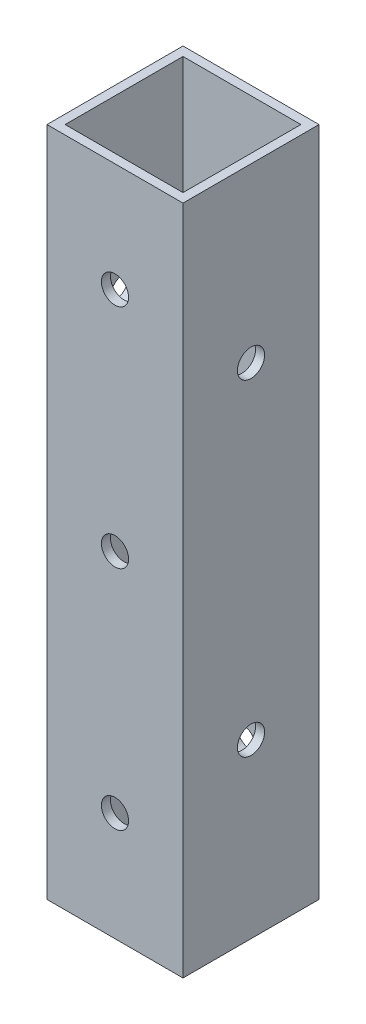
ISO-10303-21;
HEADER;
FILE_DESCRIPTION(('STEP AP214'),'2;1');
FILE_NAME('part.step','',(''),(''),'','','');
FILE_SCHEMA(('AUTOMOTIVE_DESIGN { 1 0 10303 214 1 1 1 1 }'));
ENDSEC;
DATA;
#1=APPLICATION_CONTEXT('core data for automotive mechanical design processes');
#2=APPLICATION_PROTOCOL_DEFINITION('international standard','automotive_design',2000,#1);
#3=PRODUCT_CONTEXT('',#1,'mechanical');
#4=PRODUCT('Part','Part','',(#3));
#5=PRODUCT_RELATED_PRODUCT_CATEGORY('part','',(#4));
#6=PRODUCT_DEFINITION_FORMATION('','',#4);
#7=PRODUCT_DEFINITION_CONTEXT('part definition',#1,'design');
#8=PRODUCT_DEFINITION('design','',#6,#7);
#9=PRODUCT_DEFINITION_SHAPE('','',#8);
#10=(LENGTH_UNIT() NAMED_UNIT(*) SI_UNIT(.MILLI.,.METRE.));
#11=(NAMED_UNIT(*) PLANE_ANGLE_UNIT() SI_UNIT($,.RADIAN.));
#12=(NAMED_UNIT(*) SI_UNIT($,.STERADIAN.) SOLID_ANGLE_UNIT());
#13=UNCERTAINTY_MEASURE_WITH_UNIT(LENGTH_MEASURE(1.E-05),#10,'distance_accuracy_value','');
#14=(GEOMETRIC_REPRESENTATION_CONTEXT(3) GLOBAL_UNCERTAINTY_ASSIGNED_CONTEXT((#13)) GLOBAL_UNIT_ASSIGNED_CONTEXT((#10,
#11,#12)) REPRESENTATION_CONTEXT('',''));
#15=CARTESIAN_POINT('',(0.,0.,0.));
#16=DIRECTION('',(0.,0.,1.));
#17=DIRECTION('',(1.,0.,0.));
#18=AXIS2_PLACEMENT_3D('',#15,#16,#17);
#19=CARTESIAN_POINT('',(0.,74.,0.));
#20=DIRECTION('',(0.,-1.,0.));
#21=DIRECTION('',(0.,0.,-1.));
#22=AXIS2_PLACEMENT_3D('',#19,#20,#21);
#23=PLANE('',#22);
#24=DIRECTION('',(0.,0.,-1.));
#25=VECTOR('',#24,1.);
#26=CARTESIAN_POINT('',(7.5,74.,7.5));
#27=LINE('',#26,#25);
#28=CARTESIAN_POINT('',(7.5,74.,7.5));
#29=VERTEX_POINT('',#28);
#30=CARTESIAN_POINT('',(7.5,74.,-7.5));
#31=VERTEX_POINT('',#30);
#32=EDGE_CURVE('E141',#29,#31,#27,.T.);
#33=ORIENTED_EDGE('',*,*,#32,.T.);
#34=DIRECTION('',(-1.,0.,0.));
#35=VECTOR('',#34,1.);
#36=CARTESIAN_POINT('',(-7.5,74.,-7.5));
#37=LINE('',#36,#35);
#38=CARTESIAN_POINT('',(-7.5,74.,-7.5));
#39=VERTEX_POINT('',#38);
#40=EDGE_CURVE('E144',#31,#39,#37,.T.);
#41=ORIENTED_EDGE('',*,*,#40,.T.);
#42=DIRECTION('',(0.,0.,1.));
#43=VECTOR('',#42,1.);
#44=CARTESIAN_POINT('',(-7.5,74.,7.5));
#45=LINE('',#44,#43);
#46=CARTESIAN_POINT('',(-7.5,74.,7.5));
#47=VERTEX_POINT('',#46);
#48=EDGE_CURVE('E147',#39,#47,#45,.T.);
#49=ORIENTED_EDGE('',*,*,#48,.T.);
#50=DIRECTION('',(1.,0.,0.));
#51=VECTOR('',#50,1.);
#52=CARTESIAN_POINT('',(-7.5,74.,7.5));
#53=LINE('',#52,#51);
#54=EDGE_CURVE('E149',#47,#29,#53,.T.);
#55=ORIENTED_EDGE('',*,*,#54,.T.);
#56=EDGE_LOOP('',(#33,#41,#49,#55));
#57=FACE_BOUND('',#56,.T.);
#58=DIRECTION('',(0.,0.,1.));
#59=VECTOR('',#58,1.);
#60=CARTESIAN_POINT('',(-6.5,74.,6.5));
#61=LINE('',#60,#59);
#62=CARTESIAN_POINT('',(-6.5,74.,-6.5));
#63=VERTEX_POINT('',#62);
#64=CARTESIAN_POINT('',(-6.5,74.,6.5));
#65=VERTEX_POINT('',#64);
#66=EDGE_CURVE('E103',#63,#65,#61,.T.);
#67=ORIENTED_EDGE('',*,*,#66,.F.);
#68=DIRECTION('',(-1.,0.,0.));
#69=VECTOR('',#68,1.);
#70=CARTESIAN_POINT('',(-6.5,74.,-6.5));
#71=LINE('',#70,#69);
#72=CARTESIAN_POINT('',(6.5,74.,-6.5));
#73=VERTEX_POINT('',#72);
#74=EDGE_CURVE('E125',#73,#63,#71,.T.);
#75=ORIENTED_EDGE('',*,*,#74,.F.);
#76=DIRECTION('',(0.,0.,-1.));
#77=VECTOR('',#76,1.);
#78=CARTESIAN_POINT('',(6.5,74.,6.5));
#79=LINE('',#78,#77);
#80=CARTESIAN_POINT('',(6.5,74.,6.5));
#81=VERTEX_POINT('',#80);
#82=EDGE_CURVE('E123',#81,#73,#79,.T.);
#83=ORIENTED_EDGE('',*,*,#82,.F.);
#84=DIRECTION('',(1.,0.,0.));
#85=VECTOR('',#84,1.);
#86=CARTESIAN_POINT('',(-6.5,74.,6.5));
#87=LINE('',#86,#85);
#88=EDGE_CURVE('E111',#65,#81,#87,.T.);
#89=ORIENTED_EDGE('',*,*,#88,.F.);
#90=EDGE_LOOP('',(#67,#75,#83,#89));
#91=FACE_BOUND('',#90,.T.);
#92=ADVANCED_FACE('F36',(#57,#91),#23,.F.);
#93=CARTESIAN_POINT('',(0.,0.,0.));
#94=DIRECTION('',(0.,-1.,0.));
#95=DIRECTION('',(0.,0.,-1.));
#96=AXIS2_PLACEMENT_3D('',#93,#94,#95);
#97=PLANE('',#96);
#98=DIRECTION('',(0.,0.,-1.));
#99=VECTOR('',#98,1.);
#100=CARTESIAN_POINT('',(7.5,0.,7.5));
#101=LINE('',#100,#99);
#102=CARTESIAN_POINT('',(7.5,0.,7.5));
#103=VERTEX_POINT('',#102);
#104=CARTESIAN_POINT('',(7.5,0.,-7.5));
#105=VERTEX_POINT('',#104);
#106=EDGE_CURVE('E119',#103,#105,#101,.T.);
#107=ORIENTED_EDGE('',*,*,#106,.F.);
#108=DIRECTION('',(1.,0.,0.));
#109=VECTOR('',#108,1.);
#110=CARTESIAN_POINT('',(-7.5,0.,7.5));
#111=LINE('',#110,#109);
#112=CARTESIAN_POINT('',(-7.5,0.,7.5));
#113=VERTEX_POINT('',#112);
#114=EDGE_CURVE('E145',#113,#103,#111,.T.);
#115=ORIENTED_EDGE('',*,*,#114,.F.);
#116=DIRECTION('',(0.,0.,1.));
#117=VECTOR('',#116,1.);
#118=CARTESIAN_POINT('',(-7.5,0.,7.5));
#119=LINE('',#118,#117);
#120=CARTESIAN_POINT('',(-7.5,0.,-7.5));
#121=VERTEX_POINT('',#120);
#122=EDGE_CURVE('E156',#121,#113,#119,.T.);
#123=ORIENTED_EDGE('',*,*,#122,.F.);
#124=DIRECTION('',(-1.,0.,0.));
#125=VECTOR('',#124,1.);
#126=CARTESIAN_POINT('',(-7.5,0.,-7.5));
#127=LINE('',#126,#125);
#128=EDGE_CURVE('E154',#105,#121,#127,.T.);
#129=ORIENTED_EDGE('',*,*,#128,.F.);
#130=EDGE_LOOP('',(#107,#115,#123,#129));
#131=FACE_BOUND('',#130,.T.);
#132=DIRECTION('',(-1.,0.,0.));
#133=VECTOR('',#132,1.);
#134=CARTESIAN_POINT('',(-6.5,0.,-6.5));
#135=LINE('',#134,#133);
#136=CARTESIAN_POINT('',(6.5,0.,-6.5));
#137=VERTEX_POINT('',#136);
#138=CARTESIAN_POINT('',(-6.5,0.,-6.5));
#139=VERTEX_POINT('',#138);
#140=EDGE_CURVE('E112',#137,#139,#135,.T.);
#141=ORIENTED_EDGE('',*,*,#140,.T.);
#142=DIRECTION('',(0.,0.,1.));
#143=VECTOR('',#142,1.);
#144=CARTESIAN_POINT('',(-6.5,0.,6.5));
#145=LINE('',#144,#143);
#146=CARTESIAN_POINT('',(-6.5,0.,6.5));
#147=VERTEX_POINT('',#146);
#148=EDGE_CURVE('E61',#139,#147,#145,.T.);
#149=ORIENTED_EDGE('',*,*,#148,.T.);
#150=DIRECTION('',(1.,0.,0.));
#151=VECTOR('',#150,1.);
#152=CARTESIAN_POINT('',(-6.5,0.,6.5));
#153=LINE('',#152,#151);
#154=CARTESIAN_POINT('',(6.5,0.,6.5));
#155=VERTEX_POINT('',#154);
#156=EDGE_CURVE('E118',#147,#155,#153,.T.);
#157=ORIENTED_EDGE('',*,*,#156,.T.);
#158=DIRECTION('',(0.,0.,-1.));
#159=VECTOR('',#158,1.);
#160=CARTESIAN_POINT('',(6.5,0.,6.5));
#161=LINE('',#160,#159);
#162=EDGE_CURVE('E133',#155,#137,#161,.T.);
#163=ORIENTED_EDGE('',*,*,#162,.T.);
#164=EDGE_LOOP('',(#141,#149,#157,#163));
#165=FACE_BOUND('',#164,.T.);
#166=ADVANCED_FACE('F239',(#131,#165),#97,.T.);
#167=CARTESIAN_POINT('',(7.5,74.,7.5));
#168=DIRECTION('',(-1.,0.,0.));
#169=DIRECTION('',(0.,0.,1.));
#170=AXIS2_PLACEMENT_3D('',#167,#168,#169);
#171=PLANE('',#170);
#172=CARTESIAN_POINT('',(7.5,19.,0.));
#173=DIRECTION('',(1.,0.,0.));
#174=DIRECTION('',(0.,0.,-1.));
#175=AXIS2_PLACEMENT_3D('',#172,#173,#174);
#176=CIRCLE('',#175,1.5);
#177=CARTESIAN_POINT('',(7.5,19.,-1.50000000000001));
#178=VERTEX_POINT('',#177);
#179=EDGE_CURVE('E323',#178,#178,#176,.T.);
#180=ORIENTED_EDGE('',*,*,#179,.F.);
#181=EDGE_LOOP('',(#180));
#182=FACE_BOUND('',#181,.T.);
#183=CARTESIAN_POINT('',(7.5,55.,0.));
#184=DIRECTION('',(1.,0.,0.));
#185=DIRECTION('',(0.,0.,-1.));
#186=AXIS2_PLACEMENT_3D('',#183,#184,#185);
#187=CIRCLE('',#186,1.5);
#188=CARTESIAN_POINT('',(7.5,55.,-1.50000000000001));
#189=VERTEX_POINT('',#188);
#190=EDGE_CURVE('E188',#189,#189,#187,.T.);
#191=ORIENTED_EDGE('',*,*,#190,.F.);
#192=EDGE_LOOP('',(#191));
#193=FACE_BOUND('',#192,.T.);
#194=ORIENTED_EDGE('',*,*,#106,.T.);
#195=DIRECTION('',(0.,-1.,0.));
#196=VECTOR('',#195,1.);
#197=CARTESIAN_POINT('',(7.5,74.,-7.5));
#198=LINE('',#197,#196);
#199=EDGE_CURVE('E11',#31,#105,#198,.T.);
#200=ORIENTED_EDGE('',*,*,#199,.F.);
#201=ORIENTED_EDGE('',*,*,#32,.F.);
#202=DIRECTION('',(0.,-1.,0.));
#203=VECTOR('',#202,1.);
#204=CARTESIAN_POINT('',(7.5,74.,7.5));
#205=LINE('',#204,#203);
#206=EDGE_CURVE('E151',#29,#103,#205,.T.);
#207=ORIENTED_EDGE('',*,*,#206,.T.);
#208=EDGE_LOOP('',(#194,#200,#201,#207));
#209=FACE_BOUND('',#208,.T.);
#210=ADVANCED_FACE('F38',(#182,#193,#209),#171,.F.);
#211=CARTESIAN_POINT('',(-7.5,74.,-7.5));
#212=DIRECTION('',(0.,0.,1.));
#213=DIRECTION('',(1.,0.,0.));
#214=AXIS2_PLACEMENT_3D('',#211,#212,#213);
#215=PLANE('',#214);
#216=CARTESIAN_POINT('',(0.,37.,-7.5));
#217=DIRECTION('',(0.,0.,1.));
#218=DIRECTION('',(1.,0.,0.));
#219=AXIS2_PLACEMENT_3D('',#216,#217,#218);
#220=CIRCLE('',#219,1.5);
#221=CARTESIAN_POINT('',(1.5,37.,-7.5));
#222=VERTEX_POINT('',#221);
#223=EDGE_CURVE('E174',#222,#222,#220,.T.);
#224=ORIENTED_EDGE('',*,*,#223,.T.);
#225=EDGE_LOOP('',(#224));
#226=FACE_BOUND('',#225,.T.);
#227=CARTESIAN_POINT('',(0.,12.,-7.5));
#228=DIRECTION('',(0.,0.,1.));
#229=DIRECTION('',(1.,0.,0.));
#230=AXIS2_PLACEMENT_3D('',#227,#228,#229);
#231=CIRCLE('',#230,1.5);
#232=CARTESIAN_POINT('',(1.50000000000001,12.,-7.5));
#233=VERTEX_POINT('',#232);
#234=EDGE_CURVE('E203',#233,#233,#231,.T.);
#235=ORIENTED_EDGE('',*,*,#234,.T.);
#236=EDGE_LOOP('',(#235));
#237=FACE_BOUND('',#236,.T.);
#238=CARTESIAN_POINT('',(0.,62.,-7.5));
#239=DIRECTION('',(0.,0.,1.));
#240=DIRECTION('',(1.,0.,0.));
#241=AXIS2_PLACEMENT_3D('',#238,#239,#240);
#242=CIRCLE('',#241,1.5);
#243=CARTESIAN_POINT('',(1.5,62.,-7.5));
#244=VERTEX_POINT('',#243);
#245=EDGE_CURVE('E169',#244,#244,#242,.T.);
#246=ORIENTED_EDGE('',*,*,#245,.T.);
#247=EDGE_LOOP('',(#246));
#248=FACE_BOUND('',#247,.T.);
#249=ORIENTED_EDGE('',*,*,#128,.T.);
#250=DIRECTION('',(0.,-1.,0.));
#251=VECTOR('',#250,1.);
#252=CARTESIAN_POINT('',(-7.5,74.,-7.5));
#253=LINE('',#252,#251);
#254=EDGE_CURVE('E45',#39,#121,#253,.T.);
#255=ORIENTED_EDGE('',*,*,#254,.F.);
#256=ORIENTED_EDGE('',*,*,#40,.F.);
#257=ORIENTED_EDGE('',*,*,#199,.T.);
#258=EDGE_LOOP('',(#249,#255,#256,#257));
#259=FACE_BOUND('',#258,.T.);
#260=ADVANCED_FACE('F253',(#226,#237,#248,#259),#215,.F.);
#261=CARTESIAN_POINT('',(-7.5,74.,7.5));
#262=DIRECTION('',(1.,0.,0.));
#263=DIRECTION('',(0.,0.,-1.));
#264=AXIS2_PLACEMENT_3D('',#261,#262,#263);
#265=PLANE('',#264);
#266=CARTESIAN_POINT('',(-7.5,19.,0.));
#267=DIRECTION('',(1.,0.,0.));
#268=DIRECTION('',(0.,0.,-1.));
#269=AXIS2_PLACEMENT_3D('',#266,#267,#268);
#270=CIRCLE('',#269,1.5);
#271=CARTESIAN_POINT('',(-7.5,19.,-1.50000000000001));
#272=VERTEX_POINT('',#271);
#273=EDGE_CURVE('E324',#272,#272,#270,.T.);
#274=ORIENTED_EDGE('',*,*,#273,.T.);
#275=EDGE_LOOP('',(#274));
#276=FACE_BOUND('',#275,.T.);
#277=CARTESIAN_POINT('',(-7.5,55.,0.));
#278=DIRECTION('',(1.,0.,0.));
#279=DIRECTION('',(0.,0.,-1.));
#280=AXIS2_PLACEMENT_3D('',#277,#278,#279);
#281=CIRCLE('',#280,1.5);
#282=CARTESIAN_POINT('',(-7.5,55.,-1.50000000000001));
#283=VERTEX_POINT('',#282);
#284=EDGE_CURVE('E181',#283,#283,#281,.T.);
#285=ORIENTED_EDGE('',*,*,#284,.T.);
#286=EDGE_LOOP('',(#285));
#287=FACE_BOUND('',#286,.T.);
#288=ORIENTED_EDGE('',*,*,#122,.T.);
#289=DIRECTION('',(0.,-1.,0.));
#290=VECTOR('',#289,1.);
#291=CARTESIAN_POINT('',(-7.5,74.,7.5));
#292=LINE('',#291,#290);
#293=EDGE_CURVE('E161',#47,#113,#292,.T.);
#294=ORIENTED_EDGE('',*,*,#293,.F.);
#295=ORIENTED_EDGE('',*,*,#48,.F.);
#296=ORIENTED_EDGE('',*,*,#254,.T.);
#297=EDGE_LOOP('',(#288,#294,#295,#296));
#298=FACE_BOUND('',#297,.T.);
#299=ADVANCED_FACE('F250',(#276,#287,#298),#265,.F.);
#300=CARTESIAN_POINT('',(-7.5,74.,7.5));
#301=DIRECTION('',(0.,0.,-1.));
#302=DIRECTION('',(-1.,0.,0.));
#303=AXIS2_PLACEMENT_3D('',#300,#301,#302);
#304=PLANE('',#303);
#305=CARTESIAN_POINT('',(0.,37.,7.5));
#306=DIRECTION('',(0.,0.,1.));
#307=DIRECTION('',(1.,0.,0.));
#308=AXIS2_PLACEMENT_3D('',#305,#306,#307);
#309=CIRCLE('',#308,1.5);
#310=CARTESIAN_POINT('',(1.5,37.,7.5));
#311=VERTEX_POINT('',#310);
#312=EDGE_CURVE('E200',#311,#311,#309,.T.);
#313=ORIENTED_EDGE('',*,*,#312,.F.);
#314=EDGE_LOOP('',(#313));
#315=FACE_BOUND('',#314,.T.);
#316=CARTESIAN_POINT('',(0.,12.,7.5));
#317=DIRECTION('',(0.,0.,1.));
#318=DIRECTION('',(1.,0.,0.));
#319=AXIS2_PLACEMENT_3D('',#316,#317,#318);
#320=CIRCLE('',#319,1.5);
#321=CARTESIAN_POINT('',(1.50000000000001,12.,7.5));
#322=VERTEX_POINT('',#321);
#323=EDGE_CURVE('E185',#322,#322,#320,.T.);
#324=ORIENTED_EDGE('',*,*,#323,.F.);
#325=EDGE_LOOP('',(#324));
#326=FACE_BOUND('',#325,.T.);
#327=CARTESIAN_POINT('',(0.,62.,7.5));
#328=DIRECTION('',(0.,0.,1.));
#329=DIRECTION('',(1.,0.,0.));
#330=AXIS2_PLACEMENT_3D('',#327,#328,#329);
#331=CIRCLE('',#330,1.5);
#332=CARTESIAN_POINT('',(1.5,62.,7.5));
#333=VERTEX_POINT('',#332);
#334=EDGE_CURVE('E212',#333,#333,#331,.T.);
#335=ORIENTED_EDGE('',*,*,#334,.F.);
#336=EDGE_LOOP('',(#335));
#337=FACE_BOUND('',#336,.T.);
#338=ORIENTED_EDGE('',*,*,#114,.T.);
#339=ORIENTED_EDGE('',*,*,#206,.F.);
#340=ORIENTED_EDGE('',*,*,#54,.F.);
#341=ORIENTED_EDGE('',*,*,#293,.T.);
#342=EDGE_LOOP('',(#338,#339,#340,#341));
#343=FACE_BOUND('',#342,.T.);
#344=ADVANCED_FACE('F233',(#315,#326,#337,#343),#304,.F.);
#345=CARTESIAN_POINT('',(-6.5,74.,6.5));
#346=DIRECTION('',(1.,0.,0.));
#347=DIRECTION('',(0.,0.,-1.));
#348=AXIS2_PLACEMENT_3D('',#345,#346,#347);
#349=PLANE('',#348);
#350=CARTESIAN_POINT('',(-6.5,19.,0.));
#351=DIRECTION('',(1.,0.,0.));
#352=DIRECTION('',(0.,0.,-1.));
#353=AXIS2_PLACEMENT_3D('',#350,#351,#352);
#354=CIRCLE('',#353,1.5);
#355=CARTESIAN_POINT('',(-6.5,19.,-1.50000000000001));
#356=VERTEX_POINT('',#355);
#357=EDGE_CURVE('E193',#356,#356,#354,.T.);
#358=ORIENTED_EDGE('',*,*,#357,.F.);
#359=EDGE_LOOP('',(#358));
#360=FACE_BOUND('',#359,.T.);
#361=CARTESIAN_POINT('',(-6.5,55.,0.));
#362=DIRECTION('',(1.,0.,0.));
#363=DIRECTION('',(0.,0.,-1.));
#364=AXIS2_PLACEMENT_3D('',#361,#362,#363);
#365=CIRCLE('',#364,1.5);
#366=CARTESIAN_POINT('',(-6.5,55.,-1.50000000000001));
#367=VERTEX_POINT('',#366);
#368=EDGE_CURVE('E180',#367,#367,#365,.T.);
#369=ORIENTED_EDGE('',*,*,#368,.F.);
#370=EDGE_LOOP('',(#369));
#371=FACE_BOUND('',#370,.T.);
#372=ORIENTED_EDGE('',*,*,#148,.F.);
#373=DIRECTION('',(0.,-1.,0.));
#374=VECTOR('',#373,1.);
#375=CARTESIAN_POINT('',(-6.5,74.,-6.5));
#376=LINE('',#375,#374);
#377=EDGE_CURVE('E107',#63,#139,#376,.T.);
#378=ORIENTED_EDGE('',*,*,#377,.F.);
#379=ORIENTED_EDGE('',*,*,#66,.T.);
#380=DIRECTION('',(0.,-1.,0.));
#381=VECTOR('',#380,1.);
#382=CARTESIAN_POINT('',(-6.5,74.,6.5));
#383=LINE('',#382,#381);
#384=EDGE_CURVE('E106',#65,#147,#383,.T.);
#385=ORIENTED_EDGE('',*,*,#384,.T.);
#386=EDGE_LOOP('',(#372,#378,#379,#385));
#387=FACE_BOUND('',#386,.T.);
#388=ADVANCED_FACE('F105',(#360,#371,#387),#349,.T.);
#389=CARTESIAN_POINT('',(-6.5,74.,6.5));
#390=DIRECTION('',(0.,0.,-1.));
#391=DIRECTION('',(-1.,0.,0.));
#392=AXIS2_PLACEMENT_3D('',#389,#390,#391);
#393=PLANE('',#392);
#394=CARTESIAN_POINT('',(0.,37.,6.5));
#395=DIRECTION('',(0.,0.,-1.));
#396=DIRECTION('',(-1.,0.,0.));
#397=AXIS2_PLACEMENT_3D('',#394,#395,#396);
#398=CIRCLE('',#397,1.5);
#399=CARTESIAN_POINT('',(-1.5,37.,6.5));
#400=VERTEX_POINT('',#399);
#401=EDGE_CURVE('E177',#400,#400,#398,.T.);
#402=ORIENTED_EDGE('',*,*,#401,.F.);
#403=EDGE_LOOP('',(#402));
#404=FACE_BOUND('',#403,.T.);
#405=CARTESIAN_POINT('',(0.,12.,6.5));
#406=DIRECTION('',(0.,0.,-1.));
#407=DIRECTION('',(-1.,0.,0.));
#408=AXIS2_PLACEMENT_3D('',#405,#406,#407);
#409=CIRCLE('',#408,1.5);
#410=CARTESIAN_POINT('',(-1.49999999999999,12.,6.5));
#411=VERTEX_POINT('',#410);
#412=EDGE_CURVE('E173',#411,#411,#409,.T.);
#413=ORIENTED_EDGE('',*,*,#412,.F.);
#414=EDGE_LOOP('',(#413));
#415=FACE_BOUND('',#414,.T.);
#416=CARTESIAN_POINT('',(0.,62.,6.5));
#417=DIRECTION('',(0.,0.,-1.));
#418=DIRECTION('',(-1.,0.,0.));
#419=AXIS2_PLACEMENT_3D('',#416,#417,#418);
#420=CIRCLE('',#419,1.5);
#421=CARTESIAN_POINT('',(-1.5,62.,6.5));
#422=VERTEX_POINT('',#421);
#423=EDGE_CURVE('E131',#422,#422,#420,.T.);
#424=ORIENTED_EDGE('',*,*,#423,.F.);
#425=EDGE_LOOP('',(#424));
#426=FACE_BOUND('',#425,.T.);
#427=ORIENTED_EDGE('',*,*,#156,.F.);
#428=ORIENTED_EDGE('',*,*,#384,.F.);
#429=ORIENTED_EDGE('',*,*,#88,.T.);
#430=DIRECTION('',(0.,-1.,0.));
#431=VECTOR('',#430,1.);
#432=CARTESIAN_POINT('',(6.5,74.,6.5));
#433=LINE('',#432,#431);
#434=EDGE_CURVE('E120',#81,#155,#433,.T.);
#435=ORIENTED_EDGE('',*,*,#434,.T.);
#436=EDGE_LOOP('',(#427,#428,#429,#435));
#437=FACE_BOUND('',#436,.T.);
#438=ADVANCED_FACE('F115',(#404,#415,#426,#437),#393,.T.);
#439=CARTESIAN_POINT('',(6.5,74.,6.5));
#440=DIRECTION('',(-1.,0.,0.));
#441=DIRECTION('',(0.,0.,1.));
#442=AXIS2_PLACEMENT_3D('',#439,#440,#441);
#443=PLANE('',#442);
#444=CARTESIAN_POINT('',(6.5,19.,0.));
#445=DIRECTION('',(-1.,0.,0.));
#446=DIRECTION('',(0.,0.,1.));
#447=AXIS2_PLACEMENT_3D('',#444,#445,#446);
#448=CIRCLE('',#447,1.5);
#449=CARTESIAN_POINT('',(6.5,19.,1.49999999999999));
#450=VERTEX_POINT('',#449);
#451=EDGE_CURVE('E40',#450,#450,#448,.T.);
#452=ORIENTED_EDGE('',*,*,#451,.F.);
#453=EDGE_LOOP('',(#452));
#454=FACE_BOUND('',#453,.T.);
#455=CARTESIAN_POINT('',(6.5,55.,0.));
#456=DIRECTION('',(-1.,0.,0.));
#457=DIRECTION('',(0.,0.,1.));
#458=AXIS2_PLACEMENT_3D('',#455,#456,#457);
#459=CIRCLE('',#458,1.5);
#460=CARTESIAN_POINT('',(6.5,55.,1.49999999999999));
#461=VERTEX_POINT('',#460);
#462=EDGE_CURVE('E178',#461,#461,#459,.T.);
#463=ORIENTED_EDGE('',*,*,#462,.F.);
#464=EDGE_LOOP('',(#463));
#465=FACE_BOUND('',#464,.T.);
#466=ORIENTED_EDGE('',*,*,#162,.F.);
#467=ORIENTED_EDGE('',*,*,#434,.F.);
#468=ORIENTED_EDGE('',*,*,#82,.T.);
#469=DIRECTION('',(0.,-1.,0.));
#470=VECTOR('',#469,1.);
#471=CARTESIAN_POINT('',(6.5,74.,-6.5));
#472=LINE('',#471,#470);
#473=EDGE_CURVE('E53',#73,#137,#472,.T.);
#474=ORIENTED_EDGE('',*,*,#473,.T.);
#475=EDGE_LOOP('',(#466,#467,#468,#474));
#476=FACE_BOUND('',#475,.T.);
#477=ADVANCED_FACE('F223',(#454,#465,#476),#443,.T.);
#478=CARTESIAN_POINT('',(-6.5,74.,-6.5));
#479=DIRECTION('',(0.,0.,1.));
#480=DIRECTION('',(1.,0.,0.));
#481=AXIS2_PLACEMENT_3D('',#478,#479,#480);
#482=PLANE('',#481);
#483=CARTESIAN_POINT('',(0.,37.,-6.5));
#484=DIRECTION('',(0.,0.,1.));
#485=DIRECTION('',(1.,0.,0.));
#486=AXIS2_PLACEMENT_3D('',#483,#484,#485);
#487=CIRCLE('',#486,1.5);
#488=CARTESIAN_POINT('',(1.5,37.,-6.5));
#489=VERTEX_POINT('',#488);
#490=EDGE_CURVE('E175',#489,#489,#487,.T.);
#491=ORIENTED_EDGE('',*,*,#490,.F.);
#492=EDGE_LOOP('',(#491));
#493=FACE_BOUND('',#492,.T.);
#494=CARTESIAN_POINT('',(0.,12.,-6.5));
#495=DIRECTION('',(0.,0.,1.));
#496=DIRECTION('',(1.,0.,0.));
#497=AXIS2_PLACEMENT_3D('',#494,#495,#496);
#498=CIRCLE('',#497,1.5);
#499=CARTESIAN_POINT('',(1.50000000000001,12.,-6.5));
#500=VERTEX_POINT('',#499);
#501=EDGE_CURVE('E170',#500,#500,#498,.T.);
#502=ORIENTED_EDGE('',*,*,#501,.F.);
#503=EDGE_LOOP('',(#502));
#504=FACE_BOUND('',#503,.T.);
#505=CARTESIAN_POINT('',(0.,62.,-6.5));
#506=DIRECTION('',(0.,0.,1.));
#507=DIRECTION('',(1.,0.,0.));
#508=AXIS2_PLACEMENT_3D('',#505,#506,#507);
#509=CIRCLE('',#508,1.5);
#510=CARTESIAN_POINT('',(1.5,62.,-6.5));
#511=VERTEX_POINT('',#510);
#512=EDGE_CURVE('E166',#511,#511,#509,.T.);
#513=ORIENTED_EDGE('',*,*,#512,.F.);
#514=EDGE_LOOP('',(#513));
#515=FACE_BOUND('',#514,.T.);
#516=ORIENTED_EDGE('',*,*,#140,.F.);
#517=ORIENTED_EDGE('',*,*,#473,.F.);
#518=ORIENTED_EDGE('',*,*,#74,.T.);
#519=ORIENTED_EDGE('',*,*,#377,.T.);
#520=EDGE_LOOP('',(#516,#517,#518,#519));
#521=FACE_BOUND('',#520,.T.);
#522=ADVANCED_FACE('F230',(#493,#504,#515,#521),#482,.T.);
#523=CARTESIAN_POINT('',(0.,62.,-7.5));
#524=DIRECTION('',(0.,0.,1.));
#525=DIRECTION('',(1.,0.,0.));
#526=AXIS2_PLACEMENT_3D('',#523,#524,#525);
#527=CYLINDRICAL_SURFACE('',#526,1.5);
#528=ORIENTED_EDGE('',*,*,#512,.T.);
#529=EDGE_LOOP('',(#528));
#530=FACE_BOUND('',#529,.T.);
#531=ORIENTED_EDGE('',*,*,#245,.F.);
#532=EDGE_LOOP('',(#531));
#533=FACE_BOUND('',#532,.T.);
#534=ADVANCED_FACE('F283',(#530,#533),#527,.F.);
#535=ORIENTED_EDGE('',*,*,#423,.T.);
#536=EDGE_LOOP('',(#535));
#537=FACE_BOUND('',#536,.T.);
#538=ORIENTED_EDGE('',*,*,#334,.T.);
#539=EDGE_LOOP('',(#538));
#540=FACE_BOUND('',#539,.T.);
#541=ADVANCED_FACE('F219',(#537,#540),#527,.F.);
#542=CARTESIAN_POINT('',(0.,12.,-7.5));
#543=DIRECTION('',(0.,0.,1.));
#544=DIRECTION('',(1.,0.,0.));
#545=AXIS2_PLACEMENT_3D('',#542,#543,#544);
#546=CYLINDRICAL_SURFACE('',#545,1.5);
#547=ORIENTED_EDGE('',*,*,#501,.T.);
#548=EDGE_LOOP('',(#547));
#549=FACE_BOUND('',#548,.T.);
#550=ORIENTED_EDGE('',*,*,#234,.F.);
#551=EDGE_LOOP('',(#550));
#552=FACE_BOUND('',#551,.T.);
#553=ADVANCED_FACE('F294',(#549,#552),#546,.F.);
#554=CARTESIAN_POINT('',(0.,37.,-7.5));
#555=DIRECTION('',(0.,0.,1.));
#556=DIRECTION('',(1.,0.,0.));
#557=AXIS2_PLACEMENT_3D('',#554,#555,#556);
#558=CYLINDRICAL_SURFACE('',#557,1.5);
#559=ORIENTED_EDGE('',*,*,#490,.T.);
#560=EDGE_LOOP('',(#559));
#561=FACE_BOUND('',#560,.T.);
#562=ORIENTED_EDGE('',*,*,#223,.F.);
#563=EDGE_LOOP('',(#562));
#564=FACE_BOUND('',#563,.T.);
#565=ADVANCED_FACE('F297',(#561,#564),#558,.F.);
#566=ORIENTED_EDGE('',*,*,#412,.T.);
#567=EDGE_LOOP('',(#566));
#568=FACE_BOUND('',#567,.T.);
#569=ORIENTED_EDGE('',*,*,#323,.T.);
#570=EDGE_LOOP('',(#569));
#571=FACE_BOUND('',#570,.T.);
#572=ADVANCED_FACE('F299',(#568,#571),#546,.F.);
#573=ORIENTED_EDGE('',*,*,#401,.T.);
#574=EDGE_LOOP('',(#573));
#575=FACE_BOUND('',#574,.T.);
#576=ORIENTED_EDGE('',*,*,#312,.T.);
#577=EDGE_LOOP('',(#576));
#578=FACE_BOUND('',#577,.T.);
#579=ADVANCED_FACE('F303',(#575,#578),#558,.F.);
#580=CARTESIAN_POINT('',(-7.5,55.,0.));
#581=DIRECTION('',(1.,0.,0.));
#582=DIRECTION('',(0.,0.,-1.));
#583=AXIS2_PLACEMENT_3D('',#580,#581,#582);
#584=CYLINDRICAL_SURFACE('',#583,1.5);
#585=ORIENTED_EDGE('',*,*,#462,.T.);
#586=EDGE_LOOP('',(#585));
#587=FACE_BOUND('',#586,.T.);
#588=ORIENTED_EDGE('',*,*,#190,.T.);
#589=EDGE_LOOP('',(#588));
#590=FACE_BOUND('',#589,.T.);
#591=ADVANCED_FACE('F304',(#587,#590),#584,.F.);
#592=ORIENTED_EDGE('',*,*,#368,.T.);
#593=EDGE_LOOP('',(#592));
#594=FACE_BOUND('',#593,.T.);
#595=ORIENTED_EDGE('',*,*,#284,.F.);
#596=EDGE_LOOP('',(#595));
#597=FACE_BOUND('',#596,.T.);
#598=ADVANCED_FACE('F307',(#594,#597),#584,.F.);
#599=CARTESIAN_POINT('',(-7.5,19.,0.));
#600=DIRECTION('',(1.,0.,0.));
#601=DIRECTION('',(0.,0.,-1.));
#602=AXIS2_PLACEMENT_3D('',#599,#600,#601);
#603=CYLINDRICAL_SURFACE('',#602,1.5);
#604=ORIENTED_EDGE('',*,*,#451,.T.);
#605=EDGE_LOOP('',(#604));
#606=FACE_BOUND('',#605,.T.);
#607=ORIENTED_EDGE('',*,*,#179,.T.);
#608=EDGE_LOOP('',(#607));
#609=FACE_BOUND('',#608,.T.);
#610=ADVANCED_FACE('F308',(#606,#609),#603,.F.);
#611=ORIENTED_EDGE('',*,*,#357,.T.);
#612=EDGE_LOOP('',(#611));
#613=FACE_BOUND('',#612,.T.);
#614=ORIENTED_EDGE('',*,*,#273,.F.);
#615=EDGE_LOOP('',(#614));
#616=FACE_BOUND('',#615,.T.);
#617=ADVANCED_FACE('F310',(#613,#616),#603,.F.);
#618=CLOSED_SHELL('',(#92,#166,#210,#260,#299,#344,#388,#438,#477,#522,#534,#541,#553,#565,#572,
#579,#591,#598,#610,#617));
#619=MANIFOLD_SOLID_BREP('B2',#618);
#620=ADVANCED_BREP_SHAPE_REPRESENTATION('',(#18,#619),#14);
#621=SHAPE_DEFINITION_REPRESENTATION(#9,#620);
ENDSEC;
END-ISO-10303-21;
